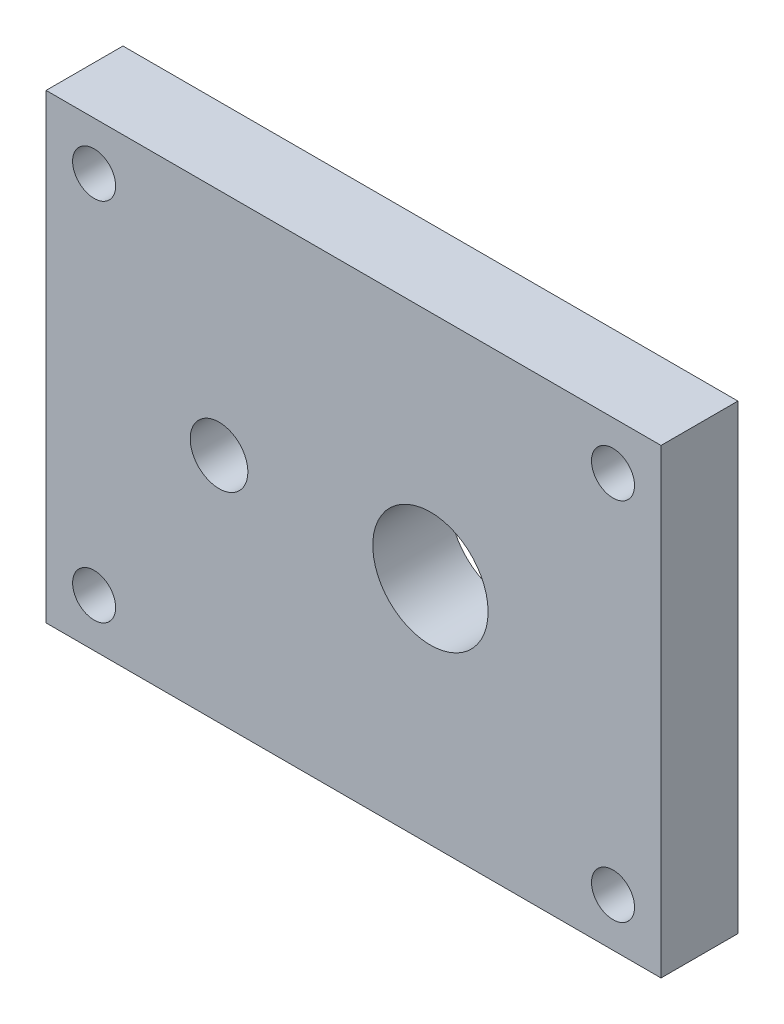
ISO-10303-21;
HEADER;
FILE_DESCRIPTION(('STEP AP214'),'2;1');
FILE_NAME('part.step','',(''),(''),'','','');
FILE_SCHEMA(('AUTOMOTIVE_DESIGN { 1 0 10303 214 1 1 1 1 }'));
ENDSEC;
DATA;
#1=APPLICATION_CONTEXT('core data for automotive mechanical design processes');
#2=APPLICATION_PROTOCOL_DEFINITION('international standard','automotive_design',2000,#1);
#3=PRODUCT_CONTEXT('',#1,'mechanical');
#4=PRODUCT('Part','Part','',(#3));
#5=PRODUCT_RELATED_PRODUCT_CATEGORY('part','',(#4));
#6=PRODUCT_DEFINITION_FORMATION('','',#4);
#7=PRODUCT_DEFINITION_CONTEXT('part definition',#1,'design');
#8=PRODUCT_DEFINITION('design','',#6,#7);
#9=PRODUCT_DEFINITION_SHAPE('','',#8);
#10=(LENGTH_UNIT() NAMED_UNIT(*) SI_UNIT(.MILLI.,.METRE.));
#11=(NAMED_UNIT(*) PLANE_ANGLE_UNIT() SI_UNIT($,.RADIAN.));
#12=(NAMED_UNIT(*) SI_UNIT($,.STERADIAN.) SOLID_ANGLE_UNIT());
#13=UNCERTAINTY_MEASURE_WITH_UNIT(LENGTH_MEASURE(1.E-05),#10,'distance_accuracy_value','');
#14=(GEOMETRIC_REPRESENTATION_CONTEXT(3) GLOBAL_UNCERTAINTY_ASSIGNED_CONTEXT((#13)) GLOBAL_UNIT_ASSIGNED_CONTEXT((#10,
#11,#12)) REPRESENTATION_CONTEXT('',''));
#15=CARTESIAN_POINT('',(0.,0.,0.));
#16=DIRECTION('',(0.,0.,1.));
#17=DIRECTION('',(1.,0.,0.));
#18=AXIS2_PLACEMENT_3D('',#15,#16,#17);
#19=CARTESIAN_POINT('',(19.05,19.05,6.35));
#20=DIRECTION('',(-1.,0.,0.));
#21=DIRECTION('',(0.,0.,1.));
#22=AXIS2_PLACEMENT_3D('',#19,#20,#21);
#23=PLANE('',#22);
#24=DIRECTION('',(0.,1.,0.));
#25=VECTOR('',#24,1.);
#26=CARTESIAN_POINT('',(19.05,19.05,0.));
#27=LINE('',#26,#25);
#28=CARTESIAN_POINT('',(19.05,-19.05,0.));
#29=VERTEX_POINT('',#28);
#30=CARTESIAN_POINT('',(19.05,19.05,0.));
#31=VERTEX_POINT('',#30);
#32=EDGE_CURVE('E567',#29,#31,#27,.T.);
#33=ORIENTED_EDGE('',*,*,#32,.T.);
#34=DIRECTION('',(0.,0.,-1.));
#35=VECTOR('',#34,1.);
#36=CARTESIAN_POINT('',(19.05,19.05,6.35));
#37=LINE('',#36,#35);
#38=CARTESIAN_POINT('',(19.05,19.05,6.35));
#39=VERTEX_POINT('',#38);
#40=EDGE_CURVE('E14',#39,#31,#37,.T.);
#41=ORIENTED_EDGE('',*,*,#40,.F.);
#42=DIRECTION('',(0.,1.,0.));
#43=VECTOR('',#42,1.);
#44=CARTESIAN_POINT('',(19.05,19.05,6.35));
#45=LINE('',#44,#43);
#46=CARTESIAN_POINT('',(19.05,-19.05,6.35));
#47=VERTEX_POINT('',#46);
#48=EDGE_CURVE('E547',#47,#39,#45,.T.);
#49=ORIENTED_EDGE('',*,*,#48,.F.);
#50=DIRECTION('',(0.,0.,-1.));
#51=VECTOR('',#50,1.);
#52=CARTESIAN_POINT('',(19.05,-19.05,6.35));
#53=LINE('',#52,#51);
#54=EDGE_CURVE('E564',#47,#29,#53,.T.);
#55=ORIENTED_EDGE('',*,*,#54,.T.);
#56=EDGE_LOOP('',(#33,#41,#49,#55));
#57=FACE_BOUND('',#56,.T.);
#58=ADVANCED_FACE('F497',(#57),#23,.F.);
#59=CARTESIAN_POINT('',(-31.75,19.05,6.35));
#60=DIRECTION('',(0.,-1.,0.));
#61=DIRECTION('',(0.,0.,-1.));
#62=AXIS2_PLACEMENT_3D('',#59,#60,#61);
#63=PLANE('',#62);
#64=DIRECTION('',(-1.,0.,0.));
#65=VECTOR('',#64,1.);
#66=CARTESIAN_POINT('',(-31.75,19.05,0.));
#67=LINE('',#66,#65);
#68=CARTESIAN_POINT('',(-31.75,19.05,0.));
#69=VERTEX_POINT('',#68);
#70=EDGE_CURVE('E554',#31,#69,#67,.T.);
#71=ORIENTED_EDGE('',*,*,#70,.T.);
#72=DIRECTION('',(0.,0.,-1.));
#73=VECTOR('',#72,1.);
#74=CARTESIAN_POINT('',(-31.75,19.05,6.35));
#75=LINE('',#74,#73);
#76=CARTESIAN_POINT('',(-31.75,19.05,6.35));
#77=VERTEX_POINT('',#76);
#78=EDGE_CURVE('E503',#77,#69,#75,.T.);
#79=ORIENTED_EDGE('',*,*,#78,.F.);
#80=DIRECTION('',(-1.,0.,0.));
#81=VECTOR('',#80,1.);
#82=CARTESIAN_POINT('',(-31.75,19.05,6.35));
#83=LINE('',#82,#81);
#84=EDGE_CURVE('E543',#39,#77,#83,.T.);
#85=ORIENTED_EDGE('',*,*,#84,.F.);
#86=ORIENTED_EDGE('',*,*,#40,.T.);
#87=EDGE_LOOP('',(#71,#79,#85,#86));
#88=FACE_BOUND('',#87,.T.);
#89=ADVANCED_FACE('F555',(#88),#63,.F.);
#90=CARTESIAN_POINT('',(-31.75,-19.05,6.35));
#91=DIRECTION('',(1.,0.,0.));
#92=DIRECTION('',(0.,1.,0.));
#93=AXIS2_PLACEMENT_3D('',#90,#91,#92);
#94=PLANE('',#93);
#95=DIRECTION('',(0.,-1.,0.));
#96=VECTOR('',#95,1.);
#97=CARTESIAN_POINT('',(-31.75,-19.05,0.));
#98=LINE('',#97,#96);
#99=CARTESIAN_POINT('',(-31.75,-19.05,0.));
#100=VERTEX_POINT('',#99);
#101=EDGE_CURVE('E529',#69,#100,#98,.T.);
#102=ORIENTED_EDGE('',*,*,#101,.T.);
#103=DIRECTION('',(0.,0.,-1.));
#104=VECTOR('',#103,1.);
#105=CARTESIAN_POINT('',(-31.75,-19.05,6.35));
#106=LINE('',#105,#104);
#107=CARTESIAN_POINT('',(-31.75,-19.05,6.35));
#108=VERTEX_POINT('',#107);
#109=EDGE_CURVE('E553',#108,#100,#106,.T.);
#110=ORIENTED_EDGE('',*,*,#109,.F.);
#111=DIRECTION('',(0.,-1.,0.));
#112=VECTOR('',#111,1.);
#113=CARTESIAN_POINT('',(-31.75,-19.05,6.35));
#114=LINE('',#113,#112);
#115=EDGE_CURVE('E546',#77,#108,#114,.T.);
#116=ORIENTED_EDGE('',*,*,#115,.F.);
#117=ORIENTED_EDGE('',*,*,#78,.T.);
#118=EDGE_LOOP('',(#102,#110,#116,#117));
#119=FACE_BOUND('',#118,.T.);
#120=ADVANCED_FACE('F557',(#119),#94,.F.);
#121=CARTESIAN_POINT('',(19.05,-19.05,6.35));
#122=DIRECTION('',(0.,1.,0.));
#123=DIRECTION('',(0.,0.,1.));
#124=AXIS2_PLACEMENT_3D('',#121,#122,#123);
#125=PLANE('',#124);
#126=DIRECTION('',(1.,0.,0.));
#127=VECTOR('',#126,1.);
#128=CARTESIAN_POINT('',(19.05,-19.05,0.));
#129=LINE('',#128,#127);
#130=EDGE_CURVE('E536',#100,#29,#129,.T.);
#131=ORIENTED_EDGE('',*,*,#130,.T.);
#132=ORIENTED_EDGE('',*,*,#54,.F.);
#133=DIRECTION('',(1.,0.,0.));
#134=VECTOR('',#133,1.);
#135=CARTESIAN_POINT('',(19.05,-19.05,6.35));
#136=LINE('',#135,#134);
#137=EDGE_CURVE('E511',#108,#47,#136,.T.);
#138=ORIENTED_EDGE('',*,*,#137,.F.);
#139=ORIENTED_EDGE('',*,*,#109,.T.);
#140=EDGE_LOOP('',(#131,#132,#138,#139));
#141=FACE_BOUND('',#140,.T.);
#142=ADVANCED_FACE('F582',(#141),#125,.F.);
#143=CARTESIAN_POINT('',(0.,0.,6.35));
#144=DIRECTION('',(0.,0.,-1.));
#145=DIRECTION('',(-1.,0.,0.));
#146=AXIS2_PLACEMENT_3D('',#143,#144,#145);
#147=PLANE('',#146);
#148=CARTESIAN_POINT('',(-27.78125,-15.08125,6.35));
#149=DIRECTION('',(0.,0.,1.));
#150=DIRECTION('',(1.,0.,0.));
#151=AXIS2_PLACEMENT_3D('',#148,#149,#150);
#152=CIRCLE('',#151,1.778);
#153=CARTESIAN_POINT('',(-26.00325,-15.08125,6.35));
#154=VERTEX_POINT('',#153);
#155=EDGE_CURVE('E616',#154,#154,#152,.T.);
#156=ORIENTED_EDGE('',*,*,#155,.F.);
#157=EDGE_LOOP('',(#156));
#158=FACE_BOUND('',#157,.T.);
#159=CARTESIAN_POINT('',(15.08125,-15.08125,6.35));
#160=DIRECTION('',(0.,0.,1.));
#161=DIRECTION('',(1.,0.,0.));
#162=AXIS2_PLACEMENT_3D('',#159,#160,#161);
#163=CIRCLE('',#162,1.778);
#164=CARTESIAN_POINT('',(16.85925,-15.08125,6.35));
#165=VERTEX_POINT('',#164);
#166=EDGE_CURVE('E630',#165,#165,#163,.T.);
#167=ORIENTED_EDGE('',*,*,#166,.F.);
#168=EDGE_LOOP('',(#167));
#169=FACE_BOUND('',#168,.T.);
#170=CARTESIAN_POINT('',(15.08125,15.08125,6.35));
#171=DIRECTION('',(0.,0.,1.));
#172=DIRECTION('',(1.,0.,0.));
#173=AXIS2_PLACEMENT_3D('',#170,#171,#172);
#174=CIRCLE('',#173,1.778);
#175=CARTESIAN_POINT('',(16.85925,15.08125,6.35));
#176=VERTEX_POINT('',#175);
#177=EDGE_CURVE('E612',#176,#176,#174,.T.);
#178=ORIENTED_EDGE('',*,*,#177,.F.);
#179=EDGE_LOOP('',(#178));
#180=FACE_BOUND('',#179,.T.);
#181=CARTESIAN_POINT('',(-27.78125,15.08125,6.35));
#182=DIRECTION('',(0.,0.,1.));
#183=DIRECTION('',(1.,0.,0.));
#184=AXIS2_PLACEMENT_3D('',#181,#182,#183);
#185=CIRCLE('',#184,1.778);
#186=CARTESIAN_POINT('',(-26.00325,15.08125,6.35));
#187=VERTEX_POINT('',#186);
#188=EDGE_CURVE('E610',#187,#187,#185,.T.);
#189=ORIENTED_EDGE('',*,*,#188,.F.);
#190=EDGE_LOOP('',(#189));
#191=FACE_BOUND('',#190,.T.);
#192=CARTESIAN_POINT('',(-17.4623029165873,0.0829644462758264,6.35));
#193=DIRECTION('',(0.,0.,1.));
#194=DIRECTION('',(1.,0.,0.));
#195=AXIS2_PLACEMENT_3D('',#192,#193,#194);
#196=CIRCLE('',#195,2.38125);
#197=CARTESIAN_POINT('',(-15.0810529165873,0.0829644462758264,6.35));
#198=VERTEX_POINT('',#197);
#199=EDGE_CURVE('E599',#198,#198,#196,.T.);
#200=ORIENTED_EDGE('',*,*,#199,.F.);
#201=EDGE_LOOP('',(#200));
#202=FACE_BOUND('',#201,.T.);
#203=CARTESIAN_POINT('',(0.,0.,6.35));
#204=DIRECTION('',(0.,0.,1.));
#205=DIRECTION('',(1.,0.,0.));
#206=AXIS2_PLACEMENT_3D('',#203,#204,#205);
#207=CIRCLE('',#206,4.7625);
#208=CARTESIAN_POINT('',(4.7625,0.,6.35));
#209=VERTEX_POINT('',#208);
#210=EDGE_CURVE('E594',#209,#209,#207,.T.);
#211=ORIENTED_EDGE('',*,*,#210,.F.);
#212=EDGE_LOOP('',(#211));
#213=FACE_BOUND('',#212,.T.);
#214=ORIENTED_EDGE('',*,*,#48,.T.);
#215=ORIENTED_EDGE('',*,*,#84,.T.);
#216=ORIENTED_EDGE('',*,*,#115,.T.);
#217=ORIENTED_EDGE('',*,*,#137,.T.);
#218=EDGE_LOOP('',(#214,#215,#216,#217));
#219=FACE_BOUND('',#218,.T.);
#220=ADVANCED_FACE('F542',(#158,#169,#180,#191,#202,#213,#219),#147,.F.);
#221=CARTESIAN_POINT('',(0.,0.,0.));
#222=DIRECTION('',(0.,0.,-1.));
#223=DIRECTION('',(-1.,0.,0.));
#224=AXIS2_PLACEMENT_3D('',#221,#222,#223);
#225=PLANE('',#224);
#226=CARTESIAN_POINT('',(-27.78125,-15.08125,0.));
#227=DIRECTION('',(0.,0.,1.));
#228=DIRECTION('',(1.,0.,0.));
#229=AXIS2_PLACEMENT_3D('',#226,#227,#228);
#230=CIRCLE('',#229,1.778);
#231=CARTESIAN_POINT('',(-26.00325,-15.08125,0.));
#232=VERTEX_POINT('',#231);
#233=EDGE_CURVE('E613',#232,#232,#230,.T.);
#234=ORIENTED_EDGE('',*,*,#233,.T.);
#235=EDGE_LOOP('',(#234));
#236=FACE_BOUND('',#235,.T.);
#237=CARTESIAN_POINT('',(15.08125,-15.08125,0.));
#238=DIRECTION('',(0.,0.,1.));
#239=DIRECTION('',(1.,0.,0.));
#240=AXIS2_PLACEMENT_3D('',#237,#238,#239);
#241=CIRCLE('',#240,1.778);
#242=CARTESIAN_POINT('',(16.85925,-15.08125,0.));
#243=VERTEX_POINT('',#242);
#244=EDGE_CURVE('E621',#243,#243,#241,.T.);
#245=ORIENTED_EDGE('',*,*,#244,.T.);
#246=EDGE_LOOP('',(#245));
#247=FACE_BOUND('',#246,.T.);
#248=CARTESIAN_POINT('',(15.08125,15.08125,0.));
#249=DIRECTION('',(0.,0.,1.));
#250=DIRECTION('',(1.,0.,0.));
#251=AXIS2_PLACEMENT_3D('',#248,#249,#250);
#252=CIRCLE('',#251,1.778);
#253=CARTESIAN_POINT('',(16.85925,15.08125,0.));
#254=VERTEX_POINT('',#253);
#255=EDGE_CURVE('E632',#254,#254,#252,.T.);
#256=ORIENTED_EDGE('',*,*,#255,.T.);
#257=EDGE_LOOP('',(#256));
#258=FACE_BOUND('',#257,.T.);
#259=CARTESIAN_POINT('',(-27.78125,15.08125,0.));
#260=DIRECTION('',(0.,0.,1.));
#261=DIRECTION('',(1.,0.,0.));
#262=AXIS2_PLACEMENT_3D('',#259,#260,#261);
#263=CIRCLE('',#262,1.778);
#264=CARTESIAN_POINT('',(-26.00325,15.08125,0.));
#265=VERTEX_POINT('',#264);
#266=EDGE_CURVE('E596',#265,#265,#263,.T.);
#267=ORIENTED_EDGE('',*,*,#266,.T.);
#268=EDGE_LOOP('',(#267));
#269=FACE_BOUND('',#268,.T.);
#270=CARTESIAN_POINT('',(-17.4623029165873,0.0829644462758264,0.));
#271=DIRECTION('',(0.,0.,1.));
#272=DIRECTION('',(1.,0.,0.));
#273=AXIS2_PLACEMENT_3D('',#270,#271,#272);
#274=CIRCLE('',#273,2.38125);
#275=CARTESIAN_POINT('',(-15.0810529165873,0.0829644462758264,0.));
#276=VERTEX_POINT('',#275);
#277=EDGE_CURVE('E568',#276,#276,#274,.T.);
#278=ORIENTED_EDGE('',*,*,#277,.T.);
#279=EDGE_LOOP('',(#278));
#280=FACE_BOUND('',#279,.T.);
#281=CARTESIAN_POINT('',(0.,0.,0.));
#282=DIRECTION('',(0.,0.,1.));
#283=DIRECTION('',(1.,0.,0.));
#284=AXIS2_PLACEMENT_3D('',#281,#282,#283);
#285=CIRCLE('',#284,4.7625);
#286=CARTESIAN_POINT('',(4.7625,0.,0.));
#287=VERTEX_POINT('',#286);
#288=EDGE_CURVE('E591',#287,#287,#285,.T.);
#289=ORIENTED_EDGE('',*,*,#288,.T.);
#290=EDGE_LOOP('',(#289));
#291=FACE_BOUND('',#290,.T.);
#292=ORIENTED_EDGE('',*,*,#32,.F.);
#293=ORIENTED_EDGE('',*,*,#130,.F.);
#294=ORIENTED_EDGE('',*,*,#101,.F.);
#295=ORIENTED_EDGE('',*,*,#70,.F.);
#296=EDGE_LOOP('',(#292,#293,#294,#295));
#297=FACE_BOUND('',#296,.T.);
#298=ADVANCED_FACE('F584',(#236,#247,#258,#269,#280,#291,#297),#225,.T.);
#299=CARTESIAN_POINT('',(0.,0.,0.));
#300=DIRECTION('',(0.,0.,1.));
#301=DIRECTION('',(1.,0.,0.));
#302=AXIS2_PLACEMENT_3D('',#299,#300,#301);
#303=CYLINDRICAL_SURFACE('',#302,4.7625);
#304=ORIENTED_EDGE('',*,*,#288,.F.);
#305=EDGE_LOOP('',(#304));
#306=FACE_BOUND('',#305,.T.);
#307=ORIENTED_EDGE('',*,*,#210,.T.);
#308=EDGE_LOOP('',(#307));
#309=FACE_BOUND('',#308,.T.);
#310=ADVANCED_FACE('F653',(#306,#309),#303,.F.);
#311=CARTESIAN_POINT('',(-17.4623029165873,0.0829644462758264,0.));
#312=DIRECTION('',(0.,0.,1.));
#313=DIRECTION('',(1.,0.,0.));
#314=AXIS2_PLACEMENT_3D('',#311,#312,#313);
#315=CYLINDRICAL_SURFACE('',#314,2.38125);
#316=ORIENTED_EDGE('',*,*,#277,.F.);
#317=EDGE_LOOP('',(#316));
#318=FACE_BOUND('',#317,.T.);
#319=ORIENTED_EDGE('',*,*,#199,.T.);
#320=EDGE_LOOP('',(#319));
#321=FACE_BOUND('',#320,.T.);
#322=ADVANCED_FACE('F654',(#318,#321),#315,.F.);
#323=CARTESIAN_POINT('',(-27.78125,15.08125,0.));
#324=DIRECTION('',(0.,0.,1.));
#325=DIRECTION('',(1.,0.,0.));
#326=AXIS2_PLACEMENT_3D('',#323,#324,#325);
#327=CYLINDRICAL_SURFACE('',#326,1.778);
#328=ORIENTED_EDGE('',*,*,#266,.F.);
#329=EDGE_LOOP('',(#328));
#330=FACE_BOUND('',#329,.T.);
#331=ORIENTED_EDGE('',*,*,#188,.T.);
#332=EDGE_LOOP('',(#331));
#333=FACE_BOUND('',#332,.T.);
#334=ADVANCED_FACE('F665',(#330,#333),#327,.F.);
#335=CARTESIAN_POINT('',(15.08125,15.08125,0.));
#336=DIRECTION('',(0.,0.,1.));
#337=DIRECTION('',(1.,0.,0.));
#338=AXIS2_PLACEMENT_3D('',#335,#336,#337);
#339=CYLINDRICAL_SURFACE('',#338,1.778);
#340=ORIENTED_EDGE('',*,*,#255,.F.);
#341=EDGE_LOOP('',(#340));
#342=FACE_BOUND('',#341,.T.);
#343=ORIENTED_EDGE('',*,*,#177,.T.);
#344=EDGE_LOOP('',(#343));
#345=FACE_BOUND('',#344,.T.);
#346=ADVANCED_FACE('F643',(#342,#345),#339,.F.);
#347=CARTESIAN_POINT('',(15.08125,-15.08125,0.));
#348=DIRECTION('',(0.,0.,1.));
#349=DIRECTION('',(1.,0.,0.));
#350=AXIS2_PLACEMENT_3D('',#347,#348,#349);
#351=CYLINDRICAL_SURFACE('',#350,1.778);
#352=ORIENTED_EDGE('',*,*,#244,.F.);
#353=EDGE_LOOP('',(#352));
#354=FACE_BOUND('',#353,.T.);
#355=ORIENTED_EDGE('',*,*,#166,.T.);
#356=EDGE_LOOP('',(#355));
#357=FACE_BOUND('',#356,.T.);
#358=ADVANCED_FACE('F728',(#354,#357),#351,.F.);
#359=CARTESIAN_POINT('',(-27.78125,-15.08125,0.));
#360=DIRECTION('',(0.,0.,1.));
#361=DIRECTION('',(1.,0.,0.));
#362=AXIS2_PLACEMENT_3D('',#359,#360,#361);
#363=CYLINDRICAL_SURFACE('',#362,1.778);
#364=ORIENTED_EDGE('',*,*,#233,.F.);
#365=EDGE_LOOP('',(#364));
#366=FACE_BOUND('',#365,.T.);
#367=ORIENTED_EDGE('',*,*,#155,.T.);
#368=EDGE_LOOP('',(#367));
#369=FACE_BOUND('',#368,.T.);
#370=ADVANCED_FACE('F736',(#366,#369),#363,.F.);
#371=CLOSED_SHELL('',(#58,#89,#120,#142,#220,#298,#310,#322,#334,#346,#358,#370));
#372=MANIFOLD_SOLID_BREP('B2',#371);
#373=ADVANCED_BREP_SHAPE_REPRESENTATION('',(#18,#372),#14);
#374=SHAPE_DEFINITION_REPRESENTATION(#9,#373);
ENDSEC;
END-ISO-10303-21;
